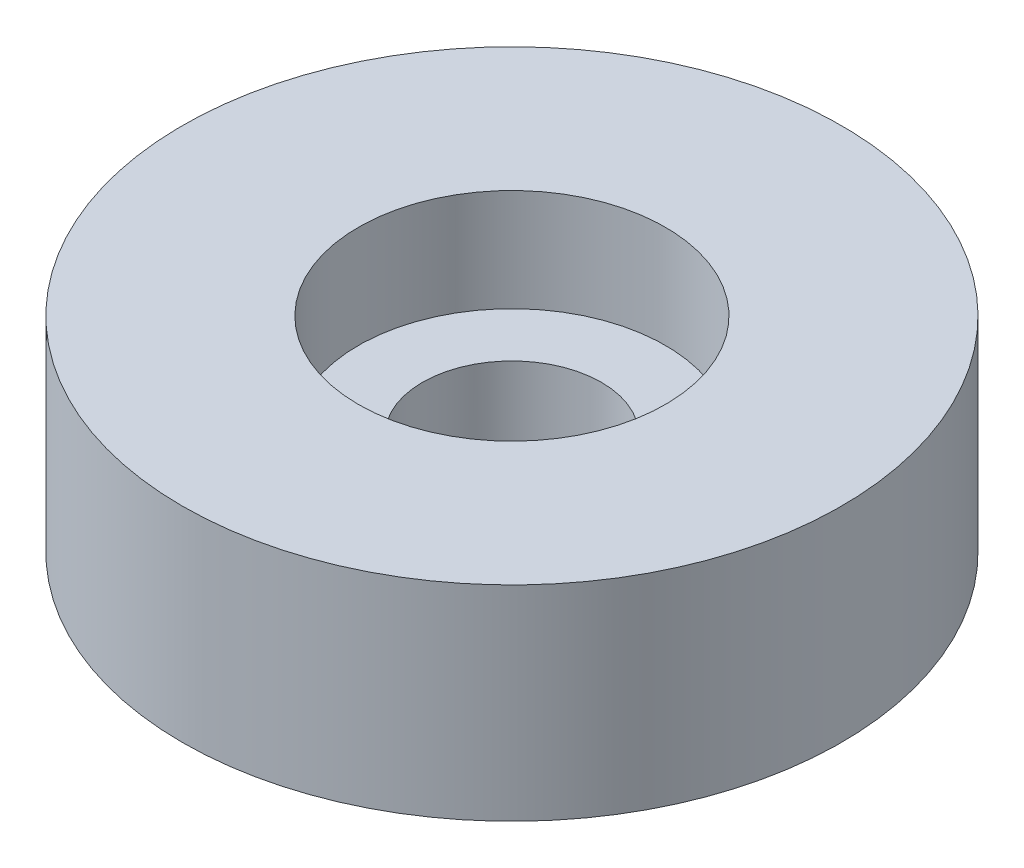
ISO-10303-21;
HEADER;
FILE_DESCRIPTION(('STEP AP214'),'2;1');
FILE_NAME('part.step','',(''),(''),'','','');
FILE_SCHEMA(('AUTOMOTIVE_DESIGN { 1 0 10303 214 1 1 1 1 }'));
ENDSEC;
DATA;
#1=APPLICATION_CONTEXT('core data for automotive mechanical design processes');
#2=APPLICATION_PROTOCOL_DEFINITION('international standard','automotive_design',2000,#1);
#3=PRODUCT_CONTEXT('',#1,'mechanical');
#4=PRODUCT('Part','Part','',(#3));
#5=PRODUCT_RELATED_PRODUCT_CATEGORY('part','',(#4));
#6=PRODUCT_DEFINITION_FORMATION('','',#4);
#7=PRODUCT_DEFINITION_CONTEXT('part definition',#1,'design');
#8=PRODUCT_DEFINITION('design','',#6,#7);
#9=PRODUCT_DEFINITION_SHAPE('','',#8);
#10=(LENGTH_UNIT() NAMED_UNIT(*) SI_UNIT(.MILLI.,.METRE.));
#11=(NAMED_UNIT(*) PLANE_ANGLE_UNIT() SI_UNIT($,.RADIAN.));
#12=(NAMED_UNIT(*) SI_UNIT($,.STERADIAN.) SOLID_ANGLE_UNIT());
#13=UNCERTAINTY_MEASURE_WITH_UNIT(LENGTH_MEASURE(1.E-05),#10,'distance_accuracy_value','');
#14=(GEOMETRIC_REPRESENTATION_CONTEXT(3) GLOBAL_UNCERTAINTY_ASSIGNED_CONTEXT((#13)) GLOBAL_UNIT_ASSIGNED_CONTEXT((#10,
#11,#12)) REPRESENTATION_CONTEXT('',''));
#15=CARTESIAN_POINT('',(0.,0.,0.));
#16=DIRECTION('',(0.,0.,1.));
#17=DIRECTION('',(1.,0.,0.));
#18=AXIS2_PLACEMENT_3D('',#15,#16,#17);
#19=CARTESIAN_POINT('',(0.,0.,0.));
#20=DIRECTION('',(0.,1.,0.));
#21=DIRECTION('',(0.,0.,1.));
#22=AXIS2_PLACEMENT_3D('',#19,#20,#21);
#23=PLANE('',#22);
#24=CARTESIAN_POINT('',(0.,0.,0.));
#25=DIRECTION('',(0.,1.,0.));
#26=DIRECTION('',(0.,0.,1.));
#27=AXIS2_PLACEMENT_3D('',#24,#25,#26);
#28=CIRCLE('',#27,6.44);
#29=CARTESIAN_POINT('',(0.,0.,6.44));
#30=VERTEX_POINT('',#29);
#31=EDGE_CURVE('E41',#30,#30,#28,.T.);
#32=ORIENTED_EDGE('',*,*,#31,.F.);
#33=EDGE_LOOP('',(#32));
#34=FACE_BOUND('',#33,.T.);
#35=CARTESIAN_POINT('',(0.,0.,0.));
#36=DIRECTION('',(0.,1.,0.));
#37=DIRECTION('',(0.,0.,1.));
#38=AXIS2_PLACEMENT_3D('',#35,#36,#37);
#39=CIRCLE('',#38,2.5);
#40=CARTESIAN_POINT('',(0.,0.,2.5));
#41=VERTEX_POINT('',#40);
#42=EDGE_CURVE('E10',#41,#41,#39,.F.);
#43=ORIENTED_EDGE('',*,*,#42,.F.);
#44=EDGE_LOOP('',(#43));
#45=FACE_BOUND('',#44,.T.);
#46=ADVANCED_FACE('F30',(#34,#45),#23,.F.);
#47=CARTESIAN_POINT('',(0.,4.,0.));
#48=DIRECTION('',(0.,-1.,0.));
#49=DIRECTION('',(0.,0.,-1.));
#50=AXIS2_PLACEMENT_3D('',#47,#48,#49);
#51=CYLINDRICAL_SURFACE('',#50,1.75);
#52=CARTESIAN_POINT('',(0.,2.,0.));
#53=DIRECTION('',(0.,1.,0.));
#54=DIRECTION('',(0.,0.,1.));
#55=AXIS2_PLACEMENT_3D('',#52,#53,#54);
#56=CIRCLE('',#55,1.75);
#57=CARTESIAN_POINT('',(0.,2.,1.75));
#58=VERTEX_POINT('',#57);
#59=EDGE_CURVE('E46',#58,#58,#56,.T.);
#60=ORIENTED_EDGE('',*,*,#59,.T.);
#61=EDGE_LOOP('',(#60));
#62=FACE_BOUND('',#61,.T.);
#63=CARTESIAN_POINT('',(0.,-0.5,0.));
#64=DIRECTION('',(0.,-1.,0.));
#65=DIRECTION('',(0.,0.,-1.));
#66=AXIS2_PLACEMENT_3D('',#63,#64,#65);
#67=CIRCLE('',#66,1.75);
#68=CARTESIAN_POINT('',(0.,-0.5,-1.75));
#69=VERTEX_POINT('',#68);
#70=EDGE_CURVE('E63',#69,#69,#67,.T.);
#71=ORIENTED_EDGE('',*,*,#70,.T.);
#72=EDGE_LOOP('',(#71));
#73=FACE_BOUND('',#72,.T.);
#74=ADVANCED_FACE('F67',(#62,#73),#51,.F.);
#75=CARTESIAN_POINT('',(0.,4.,0.));
#76=DIRECTION('',(0.,1.,0.));
#77=DIRECTION('',(0.,0.,1.));
#78=AXIS2_PLACEMENT_3D('',#75,#76,#77);
#79=PLANE('',#78);
#80=CARTESIAN_POINT('',(0.,4.,0.));
#81=DIRECTION('',(0.,1.,0.));
#82=DIRECTION('',(0.,0.,1.));
#83=AXIS2_PLACEMENT_3D('',#80,#81,#82);
#84=CIRCLE('',#83,3.);
#85=CARTESIAN_POINT('',(0.,4.,3.));
#86=VERTEX_POINT('',#85);
#87=EDGE_CURVE('E49',#86,#86,#84,.T.);
#88=ORIENTED_EDGE('',*,*,#87,.F.);
#89=EDGE_LOOP('',(#88));
#90=FACE_BOUND('',#89,.T.);
#91=CARTESIAN_POINT('',(0.,4.,0.));
#92=DIRECTION('',(0.,1.,0.));
#93=DIRECTION('',(0.,0.,1.));
#94=AXIS2_PLACEMENT_3D('',#91,#92,#93);
#95=CIRCLE('',#94,6.44);
#96=CARTESIAN_POINT('',(0.,4.,6.44));
#97=VERTEX_POINT('',#96);
#98=EDGE_CURVE('E37',#97,#97,#95,.T.);
#99=ORIENTED_EDGE('',*,*,#98,.T.);
#100=EDGE_LOOP('',(#99));
#101=FACE_BOUND('',#100,.T.);
#102=ADVANCED_FACE('F89',(#90,#101),#79,.T.);
#103=CARTESIAN_POINT('',(0.,4.,0.));
#104=DIRECTION('',(0.,-1.,0.));
#105=DIRECTION('',(0.,0.,-1.));
#106=AXIS2_PLACEMENT_3D('',#103,#104,#105);
#107=CYLINDRICAL_SURFACE('',#106,6.44);
#108=ORIENTED_EDGE('',*,*,#98,.F.);
#109=EDGE_LOOP('',(#108));
#110=FACE_BOUND('',#109,.T.);
#111=ORIENTED_EDGE('',*,*,#31,.T.);
#112=EDGE_LOOP('',(#111));
#113=FACE_BOUND('',#112,.T.);
#114=ADVANCED_FACE('F32',(#110,#113),#107,.T.);
#115=CARTESIAN_POINT('',(0.,2.,0.));
#116=DIRECTION('',(0.,1.,0.));
#117=DIRECTION('',(0.,0.,1.));
#118=AXIS2_PLACEMENT_3D('',#115,#116,#117);
#119=CYLINDRICAL_SURFACE('',#118,3.);
#120=CARTESIAN_POINT('',(0.,2.,0.));
#121=DIRECTION('',(0.,1.,0.));
#122=DIRECTION('',(0.,0.,1.));
#123=AXIS2_PLACEMENT_3D('',#120,#121,#122);
#124=CIRCLE('',#123,3.);
#125=CARTESIAN_POINT('',(0.,2.,3.));
#126=VERTEX_POINT('',#125);
#127=EDGE_CURVE('E52',#126,#126,#124,.T.);
#128=ORIENTED_EDGE('',*,*,#127,.F.);
#129=EDGE_LOOP('',(#128));
#130=FACE_BOUND('',#129,.T.);
#131=ORIENTED_EDGE('',*,*,#87,.T.);
#132=EDGE_LOOP('',(#131));
#133=FACE_BOUND('',#132,.T.);
#134=ADVANCED_FACE('F81',(#130,#133),#119,.F.);
#135=CARTESIAN_POINT('',(0.,2.,0.));
#136=DIRECTION('',(0.,1.,0.));
#137=DIRECTION('',(0.,0.,1.));
#138=AXIS2_PLACEMENT_3D('',#135,#136,#137);
#139=PLANE('',#138);
#140=ORIENTED_EDGE('',*,*,#59,.F.);
#141=EDGE_LOOP('',(#140));
#142=FACE_BOUND('',#141,.T.);
#143=ORIENTED_EDGE('',*,*,#127,.T.);
#144=EDGE_LOOP('',(#143));
#145=FACE_BOUND('',#144,.T.);
#146=ADVANCED_FACE('F72',(#142,#145),#139,.T.);
#147=CARTESIAN_POINT('',(0.,-0.5,0.));
#148=DIRECTION('',(0.,-1.,0.));
#149=DIRECTION('',(0.,0.,-1.));
#150=AXIS2_PLACEMENT_3D('',#147,#148,#149);
#151=PLANE('',#150);
#152=CARTESIAN_POINT('',(0.,-0.5,0.));
#153=DIRECTION('',(0.,-1.,0.));
#154=DIRECTION('',(0.,0.,-1.));
#155=AXIS2_PLACEMENT_3D('',#152,#153,#154);
#156=CIRCLE('',#155,2.5);
#157=CARTESIAN_POINT('',(0.,-0.5,-2.5));
#158=VERTEX_POINT('',#157);
#159=EDGE_CURVE('E59',#158,#158,#156,.T.);
#160=ORIENTED_EDGE('',*,*,#159,.T.);
#161=EDGE_LOOP('',(#160));
#162=FACE_BOUND('',#161,.T.);
#163=ORIENTED_EDGE('',*,*,#70,.F.);
#164=EDGE_LOOP('',(#163));
#165=FACE_BOUND('',#164,.T.);
#166=ADVANCED_FACE('F69',(#162,#165),#151,.T.);
#167=CARTESIAN_POINT('',(0.,-0.5,0.));
#168=DIRECTION('',(0.,1.,0.));
#169=DIRECTION('',(0.,0.,1.));
#170=AXIS2_PLACEMENT_3D('',#167,#168,#169);
#171=CYLINDRICAL_SURFACE('',#170,2.5);
#172=ORIENTED_EDGE('',*,*,#159,.F.);
#173=EDGE_LOOP('',(#172));
#174=FACE_BOUND('',#173,.T.);
#175=ORIENTED_EDGE('',*,*,#42,.T.);
#176=EDGE_LOOP('',(#175));
#177=FACE_BOUND('',#176,.T.);
#178=ADVANCED_FACE('F71',(#174,#177),#171,.T.);
#179=CLOSED_SHELL('',(#46,#74,#102,#114,#134,#146,#166,#178));
#180=MANIFOLD_SOLID_BREP('B2',#179);
#181=ADVANCED_BREP_SHAPE_REPRESENTATION('',(#18,#180),#14);
#182=SHAPE_DEFINITION_REPRESENTATION(#9,#181);
ENDSEC;
END-ISO-10303-21;
